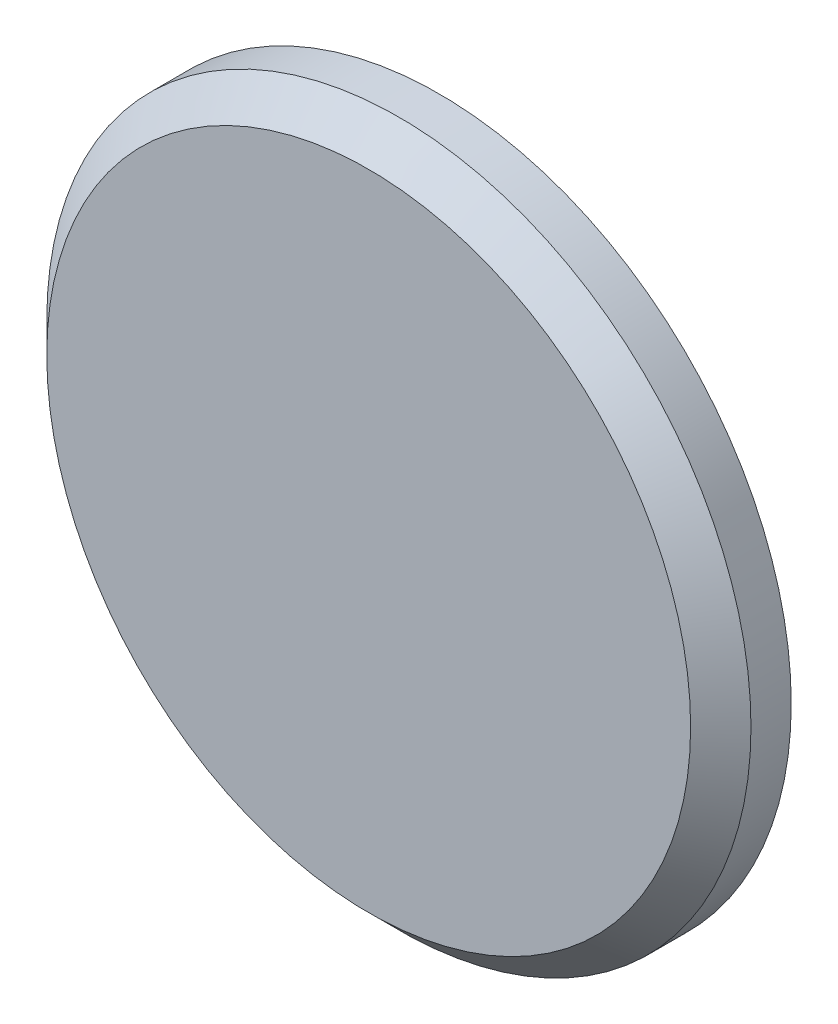
ISO-10303-21;
HEADER;
FILE_DESCRIPTION(('STEP AP214'),'2;1');
FILE_NAME('part.step','',(''),(''),'','','');
FILE_SCHEMA(('AUTOMOTIVE_DESIGN { 1 0 10303 214 1 1 1 1 }'));
ENDSEC;
DATA;
#1=APPLICATION_CONTEXT('core data for automotive mechanical design processes');
#2=APPLICATION_PROTOCOL_DEFINITION('international standard','automotive_design',2000,#1);
#3=PRODUCT_CONTEXT('',#1,'mechanical');
#4=PRODUCT('Part','Part','',(#3));
#5=PRODUCT_RELATED_PRODUCT_CATEGORY('part','',(#4));
#6=PRODUCT_DEFINITION_FORMATION('','',#4);
#7=PRODUCT_DEFINITION_CONTEXT('part definition',#1,'design');
#8=PRODUCT_DEFINITION('design','',#6,#7);
#9=PRODUCT_DEFINITION_SHAPE('','',#8);
#10=(LENGTH_UNIT() NAMED_UNIT(*) SI_UNIT(.MILLI.,.METRE.));
#11=(NAMED_UNIT(*) PLANE_ANGLE_UNIT() SI_UNIT($,.RADIAN.));
#12=(NAMED_UNIT(*) SI_UNIT($,.STERADIAN.) SOLID_ANGLE_UNIT());
#13=UNCERTAINTY_MEASURE_WITH_UNIT(LENGTH_MEASURE(1.E-05),#10,'distance_accuracy_value','');
#14=(GEOMETRIC_REPRESENTATION_CONTEXT(3) GLOBAL_UNCERTAINTY_ASSIGNED_CONTEXT((#13)) GLOBAL_UNIT_ASSIGNED_CONTEXT((#10,
#11,#12)) REPRESENTATION_CONTEXT('',''));
#15=CARTESIAN_POINT('',(0.,0.,0.));
#16=DIRECTION('',(0.,0.,1.));
#17=DIRECTION('',(1.,0.,0.));
#18=AXIS2_PLACEMENT_3D('',#15,#16,#17);
#19=CARTESIAN_POINT('',(0.,0.,7.));
#20=DIRECTION('',(0.,0.,-1.));
#21=DIRECTION('',(-1.,0.,0.));
#22=AXIS2_PLACEMENT_3D('',#19,#20,#21);
#23=CYLINDRICAL_SURFACE('',#22,35.);
#24=CARTESIAN_POINT('',(0.,0.,3.99999999999998));
#25=DIRECTION('',(0.,0.,1.));
#26=DIRECTION('',(1.,0.,0.));
#27=AXIS2_PLACEMENT_3D('',#24,#25,#26);
#28=CIRCLE('',#27,35.);
#29=CARTESIAN_POINT('',(-35.,0.,3.99999999999998));
#30=VERTEX_POINT('',#29);
#31=EDGE_CURVE('E10',#30,#30,#28,.F.);
#32=ORIENTED_EDGE('',*,*,#31,.T.);
#33=EDGE_LOOP('',(#32));
#34=FACE_BOUND('',#33,.T.);
#35=CARTESIAN_POINT('',(0.,0.,0.));
#36=DIRECTION('',(0.,0.,1.));
#37=DIRECTION('',(1.,0.,0.));
#38=AXIS2_PLACEMENT_3D('',#35,#36,#37);
#39=CIRCLE('',#38,35.);
#40=CARTESIAN_POINT('',(35.,0.,0.));
#41=VERTEX_POINT('',#40);
#42=EDGE_CURVE('E43',#41,#41,#39,.T.);
#43=ORIENTED_EDGE('',*,*,#42,.T.);
#44=EDGE_LOOP('',(#43));
#45=FACE_BOUND('',#44,.T.);
#46=ADVANCED_FACE('F32',(#34,#45),#23,.T.);
#47=CARTESIAN_POINT('',(0.,0.,7.));
#48=DIRECTION('',(0.,0.,1.));
#49=DIRECTION('',(1.,0.,0.));
#50=AXIS2_PLACEMENT_3D('',#47,#48,#49);
#51=PLANE('',#50);
#52=CARTESIAN_POINT('',(0.,0.,7.));
#53=DIRECTION('',(0.,0.,1.));
#54=DIRECTION('',(1.,0.,0.));
#55=AXIS2_PLACEMENT_3D('',#52,#53,#54);
#56=CIRCLE('',#55,32.);
#57=CARTESIAN_POINT('',(-32.,0.,7.));
#58=VERTEX_POINT('',#57);
#59=EDGE_CURVE('E39',#58,#58,#56,.T.);
#60=ORIENTED_EDGE('',*,*,#59,.T.);
#61=EDGE_LOOP('',(#60));
#62=FACE_BOUND('',#61,.T.);
#63=ADVANCED_FACE('F53',(#62),#51,.T.);
#64=CARTESIAN_POINT('',(0.,0.,0.));
#65=DIRECTION('',(0.,0.,1.));
#66=DIRECTION('',(1.,0.,0.));
#67=AXIS2_PLACEMENT_3D('',#64,#65,#66);
#68=PLANE('',#67);
#69=ORIENTED_EDGE('',*,*,#42,.F.);
#70=EDGE_LOOP('',(#69));
#71=FACE_BOUND('',#70,.T.);
#72=ADVANCED_FACE('F51',(#71),#68,.F.);
#73=CARTESIAN_POINT('',(0.,0.,7.));
#74=DIRECTION('',(0.,0.,-1.));
#75=DIRECTION('',(-1.,0.,0.));
#76=AXIS2_PLACEMENT_3D('',#73,#74,#75);
#77=CONICAL_SURFACE('',#76,32.,0.785398163397446);
#78=CARTESIAN_POINT('',(-35.,0.,3.99999999999998));
#79=CARTESIAN_POINT('',(-34.96875,0.,4.03124999999998));
#80=CARTESIAN_POINT('',(-34.9375,0.,4.06249999999998));
#81=CARTESIAN_POINT('',(-34.875,0.,4.12499999999998));
#82=CARTESIAN_POINT('',(-34.84375,0.,4.15624999999998));
#83=CARTESIAN_POINT('',(-34.78125,0.,4.21874999999998));
#84=CARTESIAN_POINT('',(-34.75,0.,4.24999999999998));
#85=CARTESIAN_POINT('',(-34.6875,0.,4.31249999999998));
#86=CARTESIAN_POINT('',(-34.65625,0.,4.34374999999998));
#87=CARTESIAN_POINT('',(-34.59375,0.,4.40624999999998));
#88=CARTESIAN_POINT('',(-34.5625,0.,4.43749999999998));
#89=CARTESIAN_POINT('',(-34.5,0.,4.49999999999998));
#90=CARTESIAN_POINT('',(-34.46875,0.,4.53124999999998));
#91=CARTESIAN_POINT('',(-34.40625,0.,4.59374999999998));
#92=CARTESIAN_POINT('',(-34.375,0.,4.62499999999998));
#93=CARTESIAN_POINT('',(-34.3125,0.,4.68749999999998));
#94=CARTESIAN_POINT('',(-34.28125,0.,4.71874999999998));
#95=CARTESIAN_POINT('',(-34.21875,0.,4.78124999999998));
#96=CARTESIAN_POINT('',(-34.1875,0.,4.81249999999998));
#97=CARTESIAN_POINT('',(-34.125,0.,4.87499999999998));
#98=CARTESIAN_POINT('',(-34.09375,0.,4.90624999999998));
#99=CARTESIAN_POINT('',(-34.03125,0.,4.96874999999998));
#100=CARTESIAN_POINT('',(-34.,0.,4.99999999999998));
#101=CARTESIAN_POINT('',(-33.9375,0.,5.06249999999998));
#102=CARTESIAN_POINT('',(-33.90625,0.,5.09374999999999));
#103=CARTESIAN_POINT('',(-33.84375,0.,5.15624999999999));
#104=CARTESIAN_POINT('',(-33.8125,0.,5.18749999999998));
#105=CARTESIAN_POINT('',(-33.75,0.,5.24999999999999));
#106=CARTESIAN_POINT('',(-33.71875,0.,5.28124999999999));
#107=CARTESIAN_POINT('',(-33.65625,0.,5.34374999999999));
#108=CARTESIAN_POINT('',(-33.625,0.,5.37499999999999));
#109=CARTESIAN_POINT('',(-33.5625,0.,5.43749999999999));
#110=CARTESIAN_POINT('',(-33.53125,0.,5.46874999999999));
#111=CARTESIAN_POINT('',(-33.46875,0.,5.53124999999999));
#112=CARTESIAN_POINT('',(-33.4375,0.,5.56249999999999));
#113=CARTESIAN_POINT('',(-33.375,0.,5.62499999999999));
#114=CARTESIAN_POINT('',(-33.34375,0.,5.65624999999999));
#115=CARTESIAN_POINT('',(-33.28125,0.,5.71874999999999));
#116=CARTESIAN_POINT('',(-33.25,0.,5.74999999999999));
#117=CARTESIAN_POINT('',(-33.1875,0.,5.81249999999999));
#118=CARTESIAN_POINT('',(-33.15625,0.,5.84374999999999));
#119=CARTESIAN_POINT('',(-33.09375,0.,5.90624999999999));
#120=CARTESIAN_POINT('',(-33.0625,0.,5.93749999999999));
#121=CARTESIAN_POINT('',(-33.,0.,5.99999999999999));
#122=CARTESIAN_POINT('',(-32.96875,0.,6.03124999999999));
#123=CARTESIAN_POINT('',(-32.90625,0.,6.09374999999999));
#124=CARTESIAN_POINT('',(-32.875,0.,6.12499999999999));
#125=CARTESIAN_POINT('',(-32.8125,0.,6.18749999999999));
#126=CARTESIAN_POINT('',(-32.78125,0.,6.21874999999999));
#127=CARTESIAN_POINT('',(-32.71875,0.,6.28124999999999));
#128=CARTESIAN_POINT('',(-32.6875,0.,6.3125));
#129=CARTESIAN_POINT('',(-32.625,0.,6.375));
#130=CARTESIAN_POINT('',(-32.59375,0.,6.40624999999999));
#131=CARTESIAN_POINT('',(-32.53125,0.,6.46875));
#132=CARTESIAN_POINT('',(-32.5,0.,6.5));
#133=CARTESIAN_POINT('',(-32.4375,0.,6.5625));
#134=CARTESIAN_POINT('',(-32.40625,0.,6.59375));
#135=CARTESIAN_POINT('',(-32.34375,0.,6.65625));
#136=CARTESIAN_POINT('',(-32.3125,0.,6.6875));
#137=CARTESIAN_POINT('',(-32.25,0.,6.75));
#138=CARTESIAN_POINT('',(-32.21875,0.,6.78125));
#139=CARTESIAN_POINT('',(-32.15625,0.,6.84375));
#140=CARTESIAN_POINT('',(-32.125,0.,6.875));
#141=CARTESIAN_POINT('',(-32.0625,0.,6.9375));
#142=CARTESIAN_POINT('',(-32.03125,0.,6.96875));
#143=CARTESIAN_POINT('',(-32.,0.,7.));
#144=B_SPLINE_CURVE_WITH_KNOTS('',3,(#78,#79,#80,#81,#82,#83,#84,#85,#86,#87,#88,#89,#90,#91,
#92,#93,#94,#95,#96,#97,#98,#99,#100,#101,#102,#103,#104,#105,#106,#107,#108,#109,#110,#111,
#112,#113,#114,#115,#116,#117,#118,#119,#120,#121,#122,#123,#124,#125,#126,#127,#128,#129,#130,
#131,#132,#133,#134,#135,#136,#137,#138,#139,#140,#141,#142,#143),.UNSPECIFIED.,.F.,.F.,(4,2,2,
2,2,2,2,2,2,2,2,2,2,2,2,2,2,2,2,2,2,2,2,2,2,2,2,2,2,2,2,2,4),(0.,0.132582521472477,
0.265165042944957,0.397747564417438,0.530330085889913,0.662912607362394,0.79549512883487,
0.928077650307351,1.06066017177983,1.19324269325231,1.32582521472478,1.45840773619726,
1.59099025766974,1.72357277914222,1.8561553006147,1.98873782208718,2.12132034355965,
2.25390286503213,2.38648538650461,2.51906790797709,2.65165042944957,2.78423295092204,
2.91681547239453,3.049397993867,3.18198051533948,3.31456303681196,3.44714555828444,
3.57972807975691,3.71231060122939,3.84489312270187,3.97747564417435,4.11005816564683,
4.24264068711931),.UNSPECIFIED.);
#145=EDGE_CURVE('BSEAM34',#30,#58,#144,.T.);
#146=ORIENTED_EDGE('',*,*,#31,.F.);
#147=ORIENTED_EDGE('',*,*,#59,.F.);
#148=ORIENTED_EDGE('',*,*,#145,.T.);
#149=ORIENTED_EDGE('',*,*,#145,.F.);
#150=EDGE_LOOP('',(#146,#148,#147,#149));
#151=FACE_BOUND('',#150,.T.);
#152=ADVANCED_FACE('F34',(#151),#77,.T.);
#153=CLOSED_SHELL('',(#46,#63,#72,#152));
#154=MANIFOLD_SOLID_BREP('B2',#153);
#155=ADVANCED_BREP_SHAPE_REPRESENTATION('',(#18,#154),#14);
#156=SHAPE_DEFINITION_REPRESENTATION(#9,#155);
ENDSEC;
END-ISO-10303-21;
